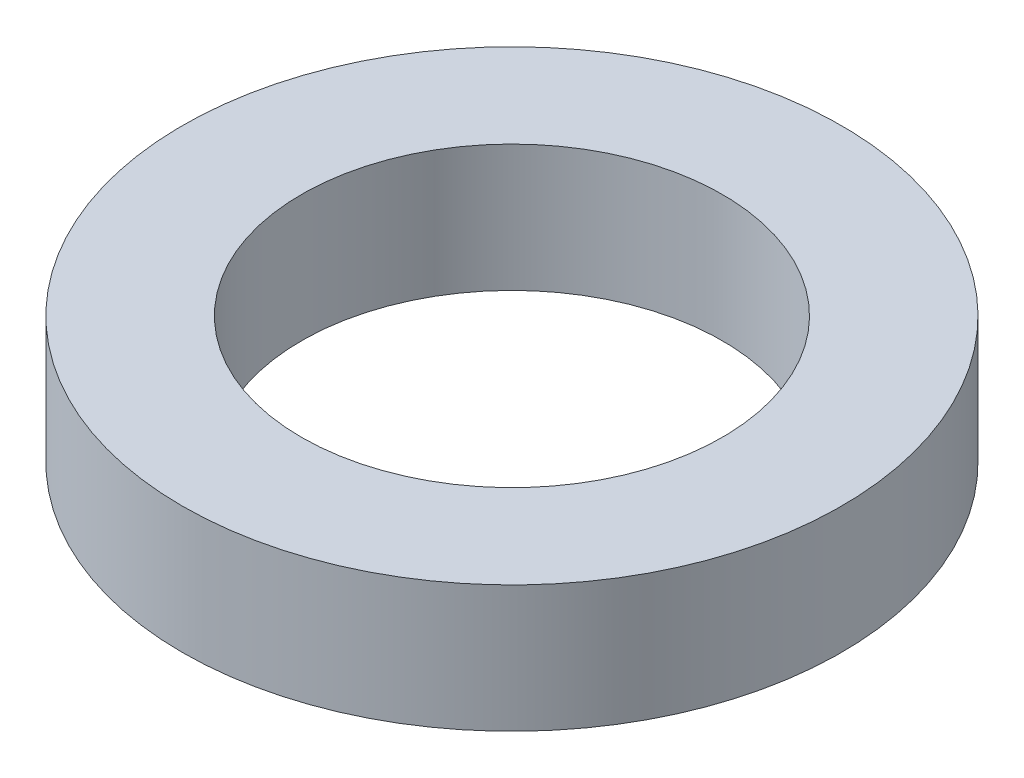
ISO-10303-21;
HEADER;
FILE_DESCRIPTION(('STEP AP214'),'2;1');
FILE_NAME('part.step','',(''),(''),'','','');
FILE_SCHEMA(('AUTOMOTIVE_DESIGN { 1 0 10303 214 1 1 1 1 }'));
ENDSEC;
DATA;
#1=APPLICATION_CONTEXT('core data for automotive mechanical design processes');
#2=APPLICATION_PROTOCOL_DEFINITION('international standard','automotive_design',2000,#1);
#3=PRODUCT_CONTEXT('',#1,'mechanical');
#4=PRODUCT('Part','Part','',(#3));
#5=PRODUCT_RELATED_PRODUCT_CATEGORY('part','',(#4));
#6=PRODUCT_DEFINITION_FORMATION('','',#4);
#7=PRODUCT_DEFINITION_CONTEXT('part definition',#1,'design');
#8=PRODUCT_DEFINITION('design','',#6,#7);
#9=PRODUCT_DEFINITION_SHAPE('','',#8);
#10=(LENGTH_UNIT() NAMED_UNIT(*) SI_UNIT(.MILLI.,.METRE.));
#11=(NAMED_UNIT(*) PLANE_ANGLE_UNIT() SI_UNIT($,.RADIAN.));
#12=(NAMED_UNIT(*) SI_UNIT($,.STERADIAN.) SOLID_ANGLE_UNIT());
#13=UNCERTAINTY_MEASURE_WITH_UNIT(LENGTH_MEASURE(1.E-05),#10,'distance_accuracy_value','');
#14=(GEOMETRIC_REPRESENTATION_CONTEXT(3) GLOBAL_UNCERTAINTY_ASSIGNED_CONTEXT((#13)) GLOBAL_UNIT_ASSIGNED_CONTEXT((#10,
#11,#12)) REPRESENTATION_CONTEXT('',''));
#15=CARTESIAN_POINT('',(0.,0.,0.));
#16=DIRECTION('',(0.,0.,1.));
#17=DIRECTION('',(1.,0.,0.));
#18=AXIS2_PLACEMENT_3D('',#15,#16,#17);
#19=CARTESIAN_POINT('',(-6.5,2.5,0.));
#20=DIRECTION('',(0.,1.,0.));
#21=DIRECTION('',(0.,0.,1.));
#22=AXIS2_PLACEMENT_3D('',#19,#20,#21);
#23=PLANE('',#22);
#24=CARTESIAN_POINT('',(0.,2.5,0.));
#25=DIRECTION('',(0.,1.,0.));
#26=DIRECTION('',(0.,0.,1.));
#27=AXIS2_PLACEMENT_3D('',#24,#25,#26);
#28=CIRCLE('',#27,4.15);
#29=CARTESIAN_POINT('',(0.,2.5,4.15));
#30=VERTEX_POINT('',#29);
#31=EDGE_CURVE('E17',#30,#30,#28,.F.);
#32=ORIENTED_EDGE('',*,*,#31,.T.);
#33=EDGE_LOOP('',(#32));
#34=FACE_BOUND('',#33,.T.);
#35=CARTESIAN_POINT('',(0.,2.5,0.));
#36=DIRECTION('',(0.,1.,0.));
#37=DIRECTION('',(0.,0.,1.));
#38=AXIS2_PLACEMENT_3D('',#35,#36,#37);
#39=CIRCLE('',#38,6.5);
#40=CARTESIAN_POINT('',(0.,2.5,6.5));
#41=VERTEX_POINT('',#40);
#42=EDGE_CURVE('E26',#41,#41,#39,.F.);
#43=ORIENTED_EDGE('',*,*,#42,.F.);
#44=EDGE_LOOP('',(#43));
#45=FACE_BOUND('',#44,.T.);
#46=ADVANCED_FACE('F14',(#34,#45),#23,.T.);
#47=CARTESIAN_POINT('',(0.,0.,0.));
#48=DIRECTION('',(0.,1.,0.));
#49=DIRECTION('',(0.,0.,1.));
#50=AXIS2_PLACEMENT_3D('',#47,#48,#49);
#51=CYLINDRICAL_SURFACE('',#50,4.15);
#52=ORIENTED_EDGE('',*,*,#31,.F.);
#53=EDGE_LOOP('',(#52));
#54=FACE_BOUND('',#53,.T.);
#55=CARTESIAN_POINT('',(0.,0.,0.));
#56=DIRECTION('',(0.,1.,0.));
#57=DIRECTION('',(0.,0.,1.));
#58=AXIS2_PLACEMENT_3D('',#55,#56,#57);
#59=CIRCLE('',#58,4.15);
#60=CARTESIAN_POINT('',(0.,0.,4.15));
#61=VERTEX_POINT('',#60);
#62=EDGE_CURVE('E21',#61,#61,#59,.T.);
#63=ORIENTED_EDGE('',*,*,#62,.F.);
#64=EDGE_LOOP('',(#63));
#65=FACE_BOUND('',#64,.T.);
#66=ADVANCED_FACE('F36',(#54,#65),#51,.F.);
#67=CARTESIAN_POINT('',(0.,0.,0.));
#68=DIRECTION('',(0.,1.,0.));
#69=DIRECTION('',(0.,0.,1.));
#70=AXIS2_PLACEMENT_3D('',#67,#68,#69);
#71=CYLINDRICAL_SURFACE('',#70,6.5);
#72=CARTESIAN_POINT('',(0.,0.,0.));
#73=DIRECTION('',(0.,1.,0.));
#74=DIRECTION('',(0.,0.,1.));
#75=AXIS2_PLACEMENT_3D('',#72,#73,#74);
#76=CIRCLE('',#75,6.5);
#77=CARTESIAN_POINT('',(0.,0.,6.5));
#78=VERTEX_POINT('',#77);
#79=EDGE_CURVE('E10',#78,#78,#76,.F.);
#80=ORIENTED_EDGE('',*,*,#79,.F.);
#81=EDGE_LOOP('',(#80));
#82=FACE_BOUND('',#81,.T.);
#83=ORIENTED_EDGE('',*,*,#42,.T.);
#84=EDGE_LOOP('',(#83));
#85=FACE_BOUND('',#84,.T.);
#86=ADVANCED_FACE('F39',(#82,#85),#71,.T.);
#87=CARTESIAN_POINT('',(-6.5,0.,0.));
#88=DIRECTION('',(0.,-1.,0.));
#89=DIRECTION('',(0.,0.,-1.));
#90=AXIS2_PLACEMENT_3D('',#87,#88,#89);
#91=PLANE('',#90);
#92=ORIENTED_EDGE('',*,*,#79,.T.);
#93=EDGE_LOOP('',(#92));
#94=FACE_BOUND('',#93,.T.);
#95=ORIENTED_EDGE('',*,*,#62,.T.);
#96=EDGE_LOOP('',(#95));
#97=FACE_BOUND('',#96,.T.);
#98=ADVANCED_FACE('F42',(#94,#97),#91,.T.);
#99=CLOSED_SHELL('',(#46,#66,#86,#98));
#100=MANIFOLD_SOLID_BREP('B1',#99);
#101=ADVANCED_BREP_SHAPE_REPRESENTATION('',(#18,#100),#14);
#102=SHAPE_DEFINITION_REPRESENTATION(#9,#101);
ENDSEC;
END-ISO-10303-21;
